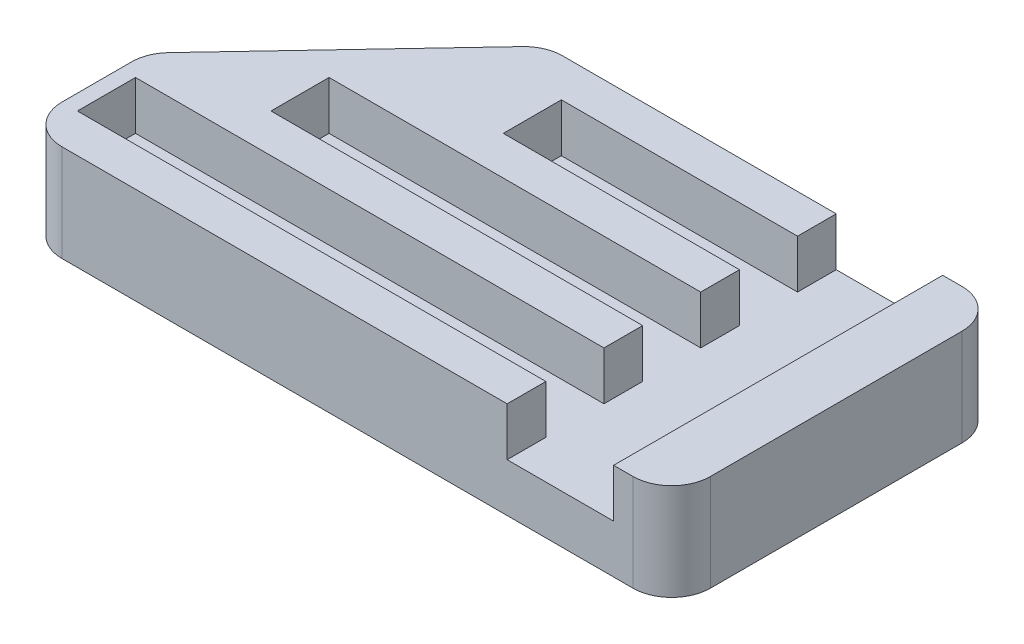
ISO-10303-21;
HEADER;
FILE_DESCRIPTION(('STEP AP214'),'2;1');
FILE_NAME('part.step','',(''),(''),'','','');
FILE_SCHEMA(('AUTOMOTIVE_DESIGN { 1 0 10303 214 1 1 1 1 }'));
ENDSEC;
DATA;
#1=APPLICATION_CONTEXT('core data for automotive mechanical design processes');
#2=APPLICATION_PROTOCOL_DEFINITION('international standard','automotive_design',2000,#1);
#3=PRODUCT_CONTEXT('',#1,'mechanical');
#4=PRODUCT('Part','Part','',(#3));
#5=PRODUCT_RELATED_PRODUCT_CATEGORY('part','',(#4));
#6=PRODUCT_DEFINITION_FORMATION('','',#4);
#7=PRODUCT_DEFINITION_CONTEXT('part definition',#1,'design');
#8=PRODUCT_DEFINITION('design','',#6,#7);
#9=PRODUCT_DEFINITION_SHAPE('','',#8);
#10=(LENGTH_UNIT() NAMED_UNIT(*) SI_UNIT(.MILLI.,.METRE.));
#11=(NAMED_UNIT(*) PLANE_ANGLE_UNIT() SI_UNIT($,.RADIAN.));
#12=(NAMED_UNIT(*) SI_UNIT($,.STERADIAN.) SOLID_ANGLE_UNIT());
#13=UNCERTAINTY_MEASURE_WITH_UNIT(LENGTH_MEASURE(1.E-05),#10,'distance_accuracy_value','');
#14=(GEOMETRIC_REPRESENTATION_CONTEXT(3) GLOBAL_UNCERTAINTY_ASSIGNED_CONTEXT((#13)) GLOBAL_UNIT_ASSIGNED_CONTEXT((#10,
#11,#12)) REPRESENTATION_CONTEXT('',''));
#15=CARTESIAN_POINT('',(0.,0.,0.));
#16=DIRECTION('',(0.,0.,1.));
#17=DIRECTION('',(1.,0.,0.));
#18=AXIS2_PLACEMENT_3D('',#15,#16,#17);
#19=CARTESIAN_POINT('',(0.,0.,0.));
#20=DIRECTION('',(0.,1.,0.));
#21=DIRECTION('',(0.,0.,1.));
#22=AXIS2_PLACEMENT_3D('',#19,#20,#21);
#23=PLANE('',#22);
#24=DIRECTION('',(-1.,0.,0.));
#25=VECTOR('',#24,1.);
#26=CARTESIAN_POINT('',(0.,0.,0.));
#27=LINE('',#26,#25);
#28=CARTESIAN_POINT('',(5.5,0.,0.));
#29=VERTEX_POINT('',#28);
#30=CARTESIAN_POINT('',(0.,0.,0.));
#31=VERTEX_POINT('',#30);
#32=EDGE_CURVE('E362',#29,#31,#27,.T.);
#33=ORIENTED_EDGE('',*,*,#32,.F.);
#34=DIRECTION('',(0.,0.,1.));
#35=VECTOR('',#34,1.);
#36=CARTESIAN_POINT('',(5.5,0.,0.));
#37=LINE('',#36,#35);
#38=CARTESIAN_POINT('',(5.5,0.,-17.));
#39=VERTEX_POINT('',#38);
#40=EDGE_CURVE('E235',#39,#29,#37,.T.);
#41=ORIENTED_EDGE('',*,*,#40,.F.);
#42=DIRECTION('',(1.,0.,0.));
#43=VECTOR('',#42,1.);
#44=CARTESIAN_POINT('',(0.,0.,-17.));
#45=LINE('',#44,#43);
#46=CARTESIAN_POINT('',(0.,0.,-17.));
#47=VERTEX_POINT('',#46);
#48=EDGE_CURVE('E219',#47,#39,#45,.T.);
#49=ORIENTED_EDGE('',*,*,#48,.F.);
#50=DIRECTION('',(0.,0.,-1.));
#51=VECTOR('',#50,1.);
#52=CARTESIAN_POINT('',(0.,0.,0.));
#53=LINE('',#52,#51);
#54=CARTESIAN_POINT('',(0.,0.,-15.));
#55=VERTEX_POINT('',#54);
#56=EDGE_CURVE('E245',#55,#47,#53,.T.);
#57=ORIENTED_EDGE('',*,*,#56,.F.);
#58=DIRECTION('',(1.,0.,0.));
#59=VECTOR('',#58,1.);
#60=CARTESIAN_POINT('',(0.,0.,-15.));
#61=LINE('',#60,#59);
#62=CARTESIAN_POINT('',(-12.2,0.,-15.));
#63=VERTEX_POINT('',#62);
#64=EDGE_CURVE('E313',#63,#55,#61,.T.);
#65=ORIENTED_EDGE('',*,*,#64,.F.);
#66=DIRECTION('',(0.,0.,-1.));
#67=VECTOR('',#66,1.);
#68=CARTESIAN_POINT('',(-12.2,0.,0.));
#69=LINE('',#68,#67);
#70=CARTESIAN_POINT('',(-12.2,0.,-12.));
#71=VERTEX_POINT('',#70);
#72=EDGE_CURVE('E310',#71,#63,#69,.T.);
#73=ORIENTED_EDGE('',*,*,#72,.F.);
#74=DIRECTION('',(-1.,0.,0.));
#75=VECTOR('',#74,1.);
#76=CARTESIAN_POINT('',(0.,0.,-12.));
#77=LINE('',#76,#75);
#78=CARTESIAN_POINT('',(0.,0.,-12.));
#79=VERTEX_POINT('',#78);
#80=EDGE_CURVE('E307',#79,#71,#77,.T.);
#81=ORIENTED_EDGE('',*,*,#80,.F.);
#82=DIRECTION('',(0.,0.,-1.));
#83=VECTOR('',#82,1.);
#84=CARTESIAN_POINT('',(0.,0.,0.));
#85=LINE('',#84,#83);
#86=CARTESIAN_POINT('',(0.,0.,-10.));
#87=VERTEX_POINT('',#86);
#88=EDGE_CURVE('E304',#87,#79,#85,.T.);
#89=ORIENTED_EDGE('',*,*,#88,.F.);
#90=DIRECTION('',(1.,0.,0.));
#91=VECTOR('',#90,1.);
#92=CARTESIAN_POINT('',(0.,0.,-10.));
#93=LINE('',#92,#91);
#94=CARTESIAN_POINT('',(-19.2,0.,-10.));
#95=VERTEX_POINT('',#94);
#96=EDGE_CURVE('E301',#95,#87,#93,.T.);
#97=ORIENTED_EDGE('',*,*,#96,.F.);
#98=DIRECTION('',(0.,0.,-1.));
#99=VECTOR('',#98,1.);
#100=CARTESIAN_POINT('',(-19.2,0.,0.));
#101=LINE('',#100,#99);
#102=CARTESIAN_POINT('',(-19.2,0.,-7.));
#103=VERTEX_POINT('',#102);
#104=EDGE_CURVE('E298',#103,#95,#101,.T.);
#105=ORIENTED_EDGE('',*,*,#104,.F.);
#106=DIRECTION('',(-1.,0.,0.));
#107=VECTOR('',#106,1.);
#108=CARTESIAN_POINT('',(0.,0.,-7.));
#109=LINE('',#108,#107);
#110=CARTESIAN_POINT('',(0.,0.,-7.));
#111=VERTEX_POINT('',#110);
#112=EDGE_CURVE('E295',#111,#103,#109,.T.);
#113=ORIENTED_EDGE('',*,*,#112,.F.);
#114=DIRECTION('',(0.,0.,-1.));
#115=VECTOR('',#114,1.);
#116=CARTESIAN_POINT('',(0.,0.,0.));
#117=LINE('',#116,#115);
#118=CARTESIAN_POINT('',(0.,0.,-5.));
#119=VERTEX_POINT('',#118);
#120=EDGE_CURVE('E292',#119,#111,#117,.T.);
#121=ORIENTED_EDGE('',*,*,#120,.F.);
#122=DIRECTION('',(1.,0.,0.));
#123=VECTOR('',#122,1.);
#124=CARTESIAN_POINT('',(0.,0.,-5.));
#125=LINE('',#124,#123);
#126=CARTESIAN_POINT('',(-24.2,0.,-5.));
#127=VERTEX_POINT('',#126);
#128=EDGE_CURVE('E289',#127,#119,#125,.T.);
#129=ORIENTED_EDGE('',*,*,#128,.F.);
#130=DIRECTION('',(0.,0.,-1.));
#131=VECTOR('',#130,1.);
#132=CARTESIAN_POINT('',(-24.2,0.,0.));
#133=LINE('',#132,#131);
#134=CARTESIAN_POINT('',(-24.2,0.,-2.));
#135=VERTEX_POINT('',#134);
#136=EDGE_CURVE('E286',#135,#127,#133,.T.);
#137=ORIENTED_EDGE('',*,*,#136,.F.);
#138=DIRECTION('',(-1.,0.,0.));
#139=VECTOR('',#138,1.);
#140=CARTESIAN_POINT('',(0.,0.,-2.));
#141=LINE('',#140,#139);
#142=CARTESIAN_POINT('',(0.,0.,-2.));
#143=VERTEX_POINT('',#142);
#144=EDGE_CURVE('E283',#143,#135,#141,.T.);
#145=ORIENTED_EDGE('',*,*,#144,.F.);
#146=DIRECTION('',(0.,0.,-1.));
#147=VECTOR('',#146,1.);
#148=CARTESIAN_POINT('',(0.,0.,0.));
#149=LINE('',#148,#147);
#150=EDGE_CURVE('E223',#31,#143,#149,.T.);
#151=ORIENTED_EDGE('',*,*,#150,.F.);
#152=EDGE_LOOP('',(#33,#41,#49,#57,#65,#73,#81,#89,#97,#105,#113,#121,#129,#137,#145,#151));
#153=FACE_BOUND('',#152,.T.);
#154=ADVANCED_FACE('F38',(#153),#23,.T.);
#155=CARTESIAN_POINT('',(0.,-2.5,-17.));
#156=DIRECTION('',(0.,0.,1.));
#157=DIRECTION('',(1.,0.,0.));
#158=AXIS2_PLACEMENT_3D('',#155,#156,#157);
#159=PLANE('',#158);
#160=DIRECTION('',(1.,0.,0.));
#161=VECTOR('',#160,1.);
#162=CARTESIAN_POINT('',(0.,-2.5,-17.));
#163=LINE('',#162,#161);
#164=CARTESIAN_POINT('',(-14.1367166432796,-2.5,-17.));
#165=VERTEX_POINT('',#164);
#166=CARTESIAN_POINT('',(6.5,-2.5,-17.));
#167=VERTEX_POINT('',#166);
#168=EDGE_CURVE('E358',#165,#167,#163,.T.);
#169=ORIENTED_EDGE('',*,*,#168,.F.);
#170=DIRECTION('',(0.,1.,0.));
#171=VECTOR('',#170,1.);
#172=CARTESIAN_POINT('',(-14.1367166432796,-2.5,-17.));
#173=LINE('',#172,#171);
#174=CARTESIAN_POINT('',(-14.1367166432796,2.5,-17.));
#175=VERTEX_POINT('',#174);
#176=EDGE_CURVE('E378',#165,#175,#173,.T.);
#177=ORIENTED_EDGE('',*,*,#176,.T.);
#178=DIRECTION('',(-1.,0.,0.));
#179=VECTOR('',#178,1.);
#180=CARTESIAN_POINT('',(0.,2.5,-17.));
#181=LINE('',#180,#179);
#182=CARTESIAN_POINT('',(0.,2.5,-17.));
#183=VERTEX_POINT('',#182);
#184=EDGE_CURVE('E277',#183,#175,#181,.T.);
#185=ORIENTED_EDGE('',*,*,#184,.F.);
#186=DIRECTION('',(0.,-1.,0.));
#187=VECTOR('',#186,1.);
#188=CARTESIAN_POINT('',(0.,2.5,-17.));
#189=LINE('',#188,#187);
#190=EDGE_CURVE('E280',#183,#47,#189,.T.);
#191=ORIENTED_EDGE('',*,*,#190,.T.);
#192=ORIENTED_EDGE('',*,*,#48,.T.);
#193=DIRECTION('',(0.,-1.,0.));
#194=VECTOR('',#193,1.);
#195=CARTESIAN_POINT('',(5.5,2.5,-17.));
#196=LINE('',#195,#194);
#197=CARTESIAN_POINT('',(5.5,2.5,-17.));
#198=VERTEX_POINT('',#197);
#199=EDGE_CURVE('E212',#198,#39,#196,.T.);
#200=ORIENTED_EDGE('',*,*,#199,.F.);
#201=DIRECTION('',(1.,0.,0.));
#202=VECTOR('',#201,1.);
#203=CARTESIAN_POINT('',(0.,2.5,-17.));
#204=LINE('',#203,#202);
#205=CARTESIAN_POINT('',(6.5,2.5,-17.));
#206=VERTEX_POINT('',#205);
#207=EDGE_CURVE('E217',#198,#206,#204,.T.);
#208=ORIENTED_EDGE('',*,*,#207,.T.);
#209=DIRECTION('',(0.,1.,0.));
#210=VECTOR('',#209,1.);
#211=CARTESIAN_POINT('',(6.5,-2.5,-17.));
#212=LINE('',#211,#210);
#213=EDGE_CURVE('E374',#206,#167,#212,.F.);
#214=ORIENTED_EDGE('',*,*,#213,.T.);
#215=EDGE_LOOP('',(#169,#177,#185,#191,#192,#200,#208,#214));
#216=FACE_BOUND('',#215,.T.);
#217=ADVANCED_FACE('F215',(#216),#159,.F.);
#218=CARTESIAN_POINT('',(8.5,-2.5,0.));
#219=DIRECTION('',(-1.,0.,0.));
#220=DIRECTION('',(0.,0.,1.));
#221=AXIS2_PLACEMENT_3D('',#218,#219,#220);
#222=PLANE('',#221);
#223=DIRECTION('',(0.,0.,1.));
#224=VECTOR('',#223,1.);
#225=CARTESIAN_POINT('',(8.5,2.5,0.));
#226=LINE('',#225,#224);
#227=CARTESIAN_POINT('',(8.5,2.5,-15.));
#228=VERTEX_POINT('',#227);
#229=CARTESIAN_POINT('',(8.5,2.5,-2.));
#230=VERTEX_POINT('',#229);
#231=EDGE_CURVE('E233',#228,#230,#226,.T.);
#232=ORIENTED_EDGE('',*,*,#231,.T.);
#233=DIRECTION('',(0.,1.,0.));
#234=VECTOR('',#233,1.);
#235=CARTESIAN_POINT('',(8.5,-2.5,-2.));
#236=LINE('',#235,#234);
#237=CARTESIAN_POINT('',(8.5,-2.5,-2.));
#238=VERTEX_POINT('',#237);
#239=EDGE_CURVE('E11',#230,#238,#236,.F.);
#240=ORIENTED_EDGE('',*,*,#239,.T.);
#241=DIRECTION('',(0.,0.,1.));
#242=VECTOR('',#241,1.);
#243=CARTESIAN_POINT('',(8.5,-2.5,0.));
#244=LINE('',#243,#242);
#245=CARTESIAN_POINT('',(8.5,-2.5,-15.));
#246=VERTEX_POINT('',#245);
#247=EDGE_CURVE('E371',#246,#238,#244,.T.);
#248=ORIENTED_EDGE('',*,*,#247,.F.);
#249=DIRECTION('',(0.,1.,0.));
#250=VECTOR('',#249,1.);
#251=CARTESIAN_POINT('',(8.5,-2.5,-15.));
#252=LINE('',#251,#250);
#253=EDGE_CURVE('E46',#246,#228,#252,.T.);
#254=ORIENTED_EDGE('',*,*,#253,.T.);
#255=EDGE_LOOP('',(#232,#240,#248,#254));
#256=FACE_BOUND('',#255,.T.);
#257=ADVANCED_FACE('F415',(#256),#222,.F.);
#258=CARTESIAN_POINT('',(0.,-2.5,0.));
#259=DIRECTION('',(0.,0.,-1.));
#260=DIRECTION('',(-1.,0.,0.));
#261=AXIS2_PLACEMENT_3D('',#258,#259,#260);
#262=PLANE('',#261);
#263=DIRECTION('',(-1.,0.,0.));
#264=VECTOR('',#263,1.);
#265=CARTESIAN_POINT('',(0.,-2.5,0.));
#266=LINE('',#265,#264);
#267=CARTESIAN_POINT('',(6.5,-2.5,0.));
#268=VERTEX_POINT('',#267);
#269=CARTESIAN_POINT('',(-23.,-2.5,0.));
#270=VERTEX_POINT('',#269);
#271=EDGE_CURVE('E368',#268,#270,#266,.T.);
#272=ORIENTED_EDGE('',*,*,#271,.F.);
#273=DIRECTION('',(0.,1.,0.));
#274=VECTOR('',#273,1.);
#275=CARTESIAN_POINT('',(6.5,-2.5,0.));
#276=LINE('',#275,#274);
#277=CARTESIAN_POINT('',(6.5,2.5,0.));
#278=VERTEX_POINT('',#277);
#279=EDGE_CURVE('E409',#268,#278,#276,.T.);
#280=ORIENTED_EDGE('',*,*,#279,.T.);
#281=DIRECTION('',(1.,0.,0.));
#282=VECTOR('',#281,1.);
#283=CARTESIAN_POINT('',(0.,2.5,0.));
#284=LINE('',#283,#282);
#285=CARTESIAN_POINT('',(5.5,2.5,0.));
#286=VERTEX_POINT('',#285);
#287=EDGE_CURVE('E230',#286,#278,#284,.T.);
#288=ORIENTED_EDGE('',*,*,#287,.F.);
#289=DIRECTION('',(0.,-1.,0.));
#290=VECTOR('',#289,1.);
#291=CARTESIAN_POINT('',(5.5,2.5,0.));
#292=LINE('',#291,#290);
#293=EDGE_CURVE('E224',#286,#29,#292,.T.);
#294=ORIENTED_EDGE('',*,*,#293,.T.);
#295=ORIENTED_EDGE('',*,*,#32,.T.);
#296=DIRECTION('',(0.,-1.,0.));
#297=VECTOR('',#296,1.);
#298=CARTESIAN_POINT('',(0.,2.5,0.));
#299=LINE('',#298,#297);
#300=CARTESIAN_POINT('',(0.,2.5,0.));
#301=VERTEX_POINT('',#300);
#302=EDGE_CURVE('E355',#301,#31,#299,.T.);
#303=ORIENTED_EDGE('',*,*,#302,.F.);
#304=DIRECTION('',(-1.,0.,0.));
#305=VECTOR('',#304,1.);
#306=CARTESIAN_POINT('',(0.,2.5,0.));
#307=LINE('',#306,#305);
#308=CARTESIAN_POINT('',(-23.,2.5,0.));
#309=VERTEX_POINT('',#308);
#310=EDGE_CURVE('E248',#301,#309,#307,.T.);
#311=ORIENTED_EDGE('',*,*,#310,.T.);
#312=DIRECTION('',(0.,1.,0.));
#313=VECTOR('',#312,1.);
#314=CARTESIAN_POINT('',(-23.,-2.5,0.));
#315=LINE('',#314,#313);
#316=EDGE_CURVE('E407',#309,#270,#315,.F.);
#317=ORIENTED_EDGE('',*,*,#316,.T.);
#318=EDGE_LOOP('',(#272,#280,#288,#294,#295,#303,#311,#317));
#319=FACE_BOUND('',#318,.T.);
#320=ADVANCED_FACE('F450',(#319),#262,.F.);
#321=CARTESIAN_POINT('',(-25.,-2.5,0.));
#322=DIRECTION('',(1.,0.,0.));
#323=DIRECTION('',(0.,0.,-1.));
#324=AXIS2_PLACEMENT_3D('',#321,#322,#323);
#325=PLANE('',#324);
#326=DIRECTION('',(0.,0.,-1.));
#327=VECTOR('',#326,1.);
#328=CARTESIAN_POINT('',(-25.,2.5,0.));
#329=LINE('',#328,#327);
#330=CARTESIAN_POINT('',(-25.,2.5,-2.));
#331=VERTEX_POINT('',#330);
#332=CARTESIAN_POINT('',(-25.,2.5,-5.59645849684286));
#333=VERTEX_POINT('',#332);
#334=EDGE_CURVE('E244',#331,#333,#329,.T.);
#335=ORIENTED_EDGE('',*,*,#334,.T.);
#336=DIRECTION('',(0.,1.,0.));
#337=VECTOR('',#336,1.);
#338=CARTESIAN_POINT('',(-25.,-2.5,-5.59645849684286));
#339=LINE('',#338,#337);
#340=CARTESIAN_POINT('',(-25.,-2.5,-5.59645849684286));
#341=VERTEX_POINT('',#340);
#342=EDGE_CURVE('E405',#333,#341,#339,.F.);
#343=ORIENTED_EDGE('',*,*,#342,.T.);
#344=DIRECTION('',(0.,0.,-1.));
#345=VECTOR('',#344,1.);
#346=CARTESIAN_POINT('',(-25.,-2.5,0.));
#347=LINE('',#346,#345);
#348=CARTESIAN_POINT('',(-25.,-2.5,-2.));
#349=VERTEX_POINT('',#348);
#350=EDGE_CURVE('E365',#349,#341,#347,.T.);
#351=ORIENTED_EDGE('',*,*,#350,.F.);
#352=DIRECTION('',(0.,1.,0.));
#353=VECTOR('',#352,1.);
#354=CARTESIAN_POINT('',(-25.,-2.5,-2.));
#355=LINE('',#354,#353);
#356=EDGE_CURVE('E402',#349,#331,#355,.T.);
#357=ORIENTED_EDGE('',*,*,#356,.T.);
#358=EDGE_LOOP('',(#335,#343,#351,#357));
#359=FACE_BOUND('',#358,.T.);
#360=ADVANCED_FACE('F441',(#359),#325,.F.);
#361=CARTESIAN_POINT('',(-16.4283935701186,-2.5,-15.4845392301185));
#362=DIRECTION('',(0.72770191100724,0.,0.685893525786919));
#363=DIRECTION('',(0.685893525786919,0.,-0.72770191100724));
#364=AXIS2_PLACEMENT_3D('',#361,#362,#363);
#365=PLANE('',#364);
#366=DIRECTION('',(0.685893525786919,0.,-0.72770191100724));
#367=VECTOR('',#366,1.);
#368=CARTESIAN_POINT('',(-16.4283935701186,2.5,-15.4845392301185));
#369=LINE('',#368,#367);
#370=CARTESIAN_POINT('',(-24.4554038220145,2.5,-6.9682455484167));
#371=VERTEX_POINT('',#370);
#372=CARTESIAN_POINT('',(-15.5921204652941,2.5,-16.3717870515738));
#373=VERTEX_POINT('',#372);
#374=EDGE_CURVE('E241',#371,#373,#369,.T.);
#375=ORIENTED_EDGE('',*,*,#374,.T.);
#376=DIRECTION('',(0.,1.,0.));
#377=VECTOR('',#376,1.);
#378=CARTESIAN_POINT('',(-15.5921204652941,-2.5,-16.3717870515738));
#379=LINE('',#378,#377);
#380=CARTESIAN_POINT('',(-15.5921204652941,-2.5,-16.3717870515738));
#381=VERTEX_POINT('',#380);
#382=EDGE_CURVE('E390',#373,#381,#379,.F.);
#383=ORIENTED_EDGE('',*,*,#382,.T.);
#384=DIRECTION('',(0.685893525786919,0.,-0.72770191100724));
#385=VECTOR('',#384,1.);
#386=CARTESIAN_POINT('',(-16.4283935701186,-2.5,-15.4845392301185));
#387=LINE('',#386,#385);
#388=CARTESIAN_POINT('',(-24.4554038220145,-2.5,-6.9682455484167));
#389=VERTEX_POINT('',#388);
#390=EDGE_CURVE('E361',#389,#381,#387,.T.);
#391=ORIENTED_EDGE('',*,*,#390,.F.);
#392=DIRECTION('',(0.,1.,0.));
#393=VECTOR('',#392,1.);
#394=CARTESIAN_POINT('',(-24.4554038220145,-2.5,-6.9682455484167));
#395=LINE('',#394,#393);
#396=EDGE_CURVE('E387',#389,#371,#395,.T.);
#397=ORIENTED_EDGE('',*,*,#396,.T.);
#398=EDGE_LOOP('',(#375,#383,#391,#397));
#399=FACE_BOUND('',#398,.T.);
#400=ADVANCED_FACE('F432',(#399),#365,.F.);
#401=CARTESIAN_POINT('',(0.,-2.5,0.));
#402=DIRECTION('',(0.,1.,0.));
#403=DIRECTION('',(0.,0.,1.));
#404=AXIS2_PLACEMENT_3D('',#401,#402,#403);
#405=PLANE('',#404);
#406=ORIENTED_EDGE('',*,*,#390,.T.);
#407=CARTESIAN_POINT('',(-14.1367166432796,-2.5,-15.));
#408=DIRECTION('',(0.,1.,0.));
#409=DIRECTION('',(0.,0.,1.));
#410=AXIS2_PLACEMENT_3D('',#407,#408,#409);
#411=CIRCLE('',#410,2.);
#412=EDGE_CURVE('E400',#381,#165,#411,.F.);
#413=ORIENTED_EDGE('',*,*,#412,.T.);
#414=ORIENTED_EDGE('',*,*,#168,.T.);
#415=CARTESIAN_POINT('',(6.5,-2.5,-15.));
#416=DIRECTION('',(0.,1.,0.));
#417=DIRECTION('',(0.,0.,1.));
#418=AXIS2_PLACEMENT_3D('',#415,#416,#417);
#419=CIRCLE('',#418,2.);
#420=EDGE_CURVE('E394',#167,#246,#419,.F.);
#421=ORIENTED_EDGE('',*,*,#420,.T.);
#422=ORIENTED_EDGE('',*,*,#247,.T.);
#423=CARTESIAN_POINT('',(6.5,-2.5,-2.));
#424=DIRECTION('',(0.,1.,0.));
#425=DIRECTION('',(0.,0.,1.));
#426=AXIS2_PLACEMENT_3D('',#423,#424,#425);
#427=CIRCLE('',#426,2.);
#428=EDGE_CURVE('E396',#238,#268,#427,.F.);
#429=ORIENTED_EDGE('',*,*,#428,.T.);
#430=ORIENTED_EDGE('',*,*,#271,.T.);
#431=CARTESIAN_POINT('',(-23.,-2.5,-2.));
#432=DIRECTION('',(0.,1.,0.));
#433=DIRECTION('',(0.,0.,1.));
#434=AXIS2_PLACEMENT_3D('',#431,#432,#433);
#435=CIRCLE('',#434,2.);
#436=EDGE_CURVE('E392',#270,#349,#435,.F.);
#437=ORIENTED_EDGE('',*,*,#436,.T.);
#438=ORIENTED_EDGE('',*,*,#350,.T.);
#439=CARTESIAN_POINT('',(-23.,-2.5,-5.59645849684286));
#440=DIRECTION('',(0.,1.,0.));
#441=DIRECTION('',(0.,0.,1.));
#442=AXIS2_PLACEMENT_3D('',#439,#440,#441);
#443=CIRCLE('',#442,2.);
#444=EDGE_CURVE('E398',#341,#389,#443,.F.);
#445=ORIENTED_EDGE('',*,*,#444,.T.);
#446=EDGE_LOOP('',(#406,#413,#414,#421,#422,#429,#430,#437,#438,#445));
#447=FACE_BOUND('',#446,.T.);
#448=ADVANCED_FACE('F420',(#447),#405,.F.);
#449=CARTESIAN_POINT('',(0.,2.5,0.));
#450=DIRECTION('',(-1.,0.,0.));
#451=DIRECTION('',(0.,0.,1.));
#452=AXIS2_PLACEMENT_3D('',#449,#450,#451);
#453=PLANE('',#452);
#454=ORIENTED_EDGE('',*,*,#150,.T.);
#455=DIRECTION('',(0.,-1.,0.));
#456=VECTOR('',#455,1.);
#457=CARTESIAN_POINT('',(0.,2.5,-2.));
#458=LINE('',#457,#456);
#459=CARTESIAN_POINT('',(0.,2.5,-2.));
#460=VERTEX_POINT('',#459);
#461=EDGE_CURVE('E352',#460,#143,#458,.T.);
#462=ORIENTED_EDGE('',*,*,#461,.F.);
#463=DIRECTION('',(0.,0.,-1.));
#464=VECTOR('',#463,1.);
#465=CARTESIAN_POINT('',(0.,2.5,0.));
#466=LINE('',#465,#464);
#467=EDGE_CURVE('E251',#301,#460,#466,.T.);
#468=ORIENTED_EDGE('',*,*,#467,.F.);
#469=ORIENTED_EDGE('',*,*,#302,.T.);
#470=EDGE_LOOP('',(#454,#462,#468,#469));
#471=FACE_BOUND('',#470,.T.);
#472=ADVANCED_FACE('F456',(#471),#453,.F.);
#473=CARTESIAN_POINT('',(0.,2.5,-2.));
#474=DIRECTION('',(0.,0.,1.));
#475=DIRECTION('',(1.,0.,0.));
#476=AXIS2_PLACEMENT_3D('',#473,#474,#475);
#477=PLANE('',#476);
#478=ORIENTED_EDGE('',*,*,#144,.T.);
#479=DIRECTION('',(0.,-1.,0.));
#480=VECTOR('',#479,1.);
#481=CARTESIAN_POINT('',(-24.2,2.5,-2.));
#482=LINE('',#481,#480);
#483=CARTESIAN_POINT('',(-24.2,2.5,-2.));
#484=VERTEX_POINT('',#483);
#485=EDGE_CURVE('E349',#484,#135,#482,.T.);
#486=ORIENTED_EDGE('',*,*,#485,.F.);
#487=DIRECTION('',(-1.,0.,0.));
#488=VECTOR('',#487,1.);
#489=CARTESIAN_POINT('',(0.,2.5,-2.));
#490=LINE('',#489,#488);
#491=EDGE_CURVE('E253',#460,#484,#490,.T.);
#492=ORIENTED_EDGE('',*,*,#491,.F.);
#493=ORIENTED_EDGE('',*,*,#461,.T.);
#494=EDGE_LOOP('',(#478,#486,#492,#493));
#495=FACE_BOUND('',#494,.T.);
#496=ADVANCED_FACE('F462',(#495),#477,.F.);
#497=CARTESIAN_POINT('',(-24.2,2.5,0.));
#498=DIRECTION('',(-1.,0.,0.));
#499=DIRECTION('',(0.,0.,1.));
#500=AXIS2_PLACEMENT_3D('',#497,#498,#499);
#501=PLANE('',#500);
#502=ORIENTED_EDGE('',*,*,#136,.T.);
#503=DIRECTION('',(0.,-1.,0.));
#504=VECTOR('',#503,1.);
#505=CARTESIAN_POINT('',(-24.2,2.5,-5.));
#506=LINE('',#505,#504);
#507=CARTESIAN_POINT('',(-24.2,2.5,-5.));
#508=VERTEX_POINT('',#507);
#509=EDGE_CURVE('E346',#508,#127,#506,.T.);
#510=ORIENTED_EDGE('',*,*,#509,.F.);
#511=DIRECTION('',(0.,0.,-1.));
#512=VECTOR('',#511,1.);
#513=CARTESIAN_POINT('',(-24.2,2.5,0.));
#514=LINE('',#513,#512);
#515=EDGE_CURVE('E255',#484,#508,#514,.T.);
#516=ORIENTED_EDGE('',*,*,#515,.F.);
#517=ORIENTED_EDGE('',*,*,#485,.T.);
#518=EDGE_LOOP('',(#502,#510,#516,#517));
#519=FACE_BOUND('',#518,.T.);
#520=ADVANCED_FACE('F464',(#519),#501,.F.);
#521=CARTESIAN_POINT('',(0.,2.5,-5.));
#522=DIRECTION('',(0.,0.,-1.));
#523=DIRECTION('',(-1.,0.,0.));
#524=AXIS2_PLACEMENT_3D('',#521,#522,#523);
#525=PLANE('',#524);
#526=ORIENTED_EDGE('',*,*,#128,.T.);
#527=DIRECTION('',(0.,-1.,0.));
#528=VECTOR('',#527,1.);
#529=CARTESIAN_POINT('',(0.,2.5,-5.));
#530=LINE('',#529,#528);
#531=CARTESIAN_POINT('',(0.,2.5,-5.));
#532=VERTEX_POINT('',#531);
#533=EDGE_CURVE('E343',#532,#119,#530,.T.);
#534=ORIENTED_EDGE('',*,*,#533,.F.);
#535=DIRECTION('',(1.,0.,0.));
#536=VECTOR('',#535,1.);
#537=CARTESIAN_POINT('',(0.,2.5,-5.));
#538=LINE('',#537,#536);
#539=EDGE_CURVE('E257',#508,#532,#538,.T.);
#540=ORIENTED_EDGE('',*,*,#539,.F.);
#541=ORIENTED_EDGE('',*,*,#509,.T.);
#542=EDGE_LOOP('',(#526,#534,#540,#541));
#543=FACE_BOUND('',#542,.T.);
#544=ADVANCED_FACE('F468',(#543),#525,.F.);
#545=CARTESIAN_POINT('',(0.,2.5,0.));
#546=DIRECTION('',(-1.,0.,0.));
#547=DIRECTION('',(0.,0.,1.));
#548=AXIS2_PLACEMENT_3D('',#545,#546,#547);
#549=PLANE('',#548);
#550=ORIENTED_EDGE('',*,*,#120,.T.);
#551=DIRECTION('',(0.,-1.,0.));
#552=VECTOR('',#551,1.);
#553=CARTESIAN_POINT('',(0.,2.5,-7.));
#554=LINE('',#553,#552);
#555=CARTESIAN_POINT('',(0.,2.5,-7.));
#556=VERTEX_POINT('',#555);
#557=EDGE_CURVE('E340',#556,#111,#554,.T.);
#558=ORIENTED_EDGE('',*,*,#557,.F.);
#559=DIRECTION('',(0.,0.,-1.));
#560=VECTOR('',#559,1.);
#561=CARTESIAN_POINT('',(0.,2.5,0.));
#562=LINE('',#561,#560);
#563=EDGE_CURVE('E259',#532,#556,#562,.T.);
#564=ORIENTED_EDGE('',*,*,#563,.F.);
#565=ORIENTED_EDGE('',*,*,#533,.T.);
#566=EDGE_LOOP('',(#550,#558,#564,#565));
#567=FACE_BOUND('',#566,.T.);
#568=ADVANCED_FACE('F474',(#567),#549,.F.);
#569=CARTESIAN_POINT('',(0.,2.5,-7.));
#570=DIRECTION('',(0.,0.,1.));
#571=DIRECTION('',(1.,0.,0.));
#572=AXIS2_PLACEMENT_3D('',#569,#570,#571);
#573=PLANE('',#572);
#574=ORIENTED_EDGE('',*,*,#112,.T.);
#575=DIRECTION('',(0.,-1.,0.));
#576=VECTOR('',#575,1.);
#577=CARTESIAN_POINT('',(-19.2,2.5,-7.));
#578=LINE('',#577,#576);
#579=CARTESIAN_POINT('',(-19.2,2.5,-7.));
#580=VERTEX_POINT('',#579);
#581=EDGE_CURVE('E337',#580,#103,#578,.T.);
#582=ORIENTED_EDGE('',*,*,#581,.F.);
#583=DIRECTION('',(-1.,0.,0.));
#584=VECTOR('',#583,1.);
#585=CARTESIAN_POINT('',(0.,2.5,-7.));
#586=LINE('',#585,#584);
#587=EDGE_CURVE('E261',#556,#580,#586,.T.);
#588=ORIENTED_EDGE('',*,*,#587,.F.);
#589=ORIENTED_EDGE('',*,*,#557,.T.);
#590=EDGE_LOOP('',(#574,#582,#588,#589));
#591=FACE_BOUND('',#590,.T.);
#592=ADVANCED_FACE('F476',(#591),#573,.F.);
#593=CARTESIAN_POINT('',(-19.2,2.5,0.));
#594=DIRECTION('',(-1.,0.,0.));
#595=DIRECTION('',(0.,0.,1.));
#596=AXIS2_PLACEMENT_3D('',#593,#594,#595);
#597=PLANE('',#596);
#598=ORIENTED_EDGE('',*,*,#104,.T.);
#599=DIRECTION('',(0.,-1.,0.));
#600=VECTOR('',#599,1.);
#601=CARTESIAN_POINT('',(-19.2,2.5,-10.));
#602=LINE('',#601,#600);
#603=CARTESIAN_POINT('',(-19.2,2.5,-10.));
#604=VERTEX_POINT('',#603);
#605=EDGE_CURVE('E334',#604,#95,#602,.T.);
#606=ORIENTED_EDGE('',*,*,#605,.F.);
#607=DIRECTION('',(0.,0.,-1.));
#608=VECTOR('',#607,1.);
#609=CARTESIAN_POINT('',(-19.2,2.5,0.));
#610=LINE('',#609,#608);
#611=EDGE_CURVE('E263',#580,#604,#610,.T.);
#612=ORIENTED_EDGE('',*,*,#611,.F.);
#613=ORIENTED_EDGE('',*,*,#581,.T.);
#614=EDGE_LOOP('',(#598,#606,#612,#613));
#615=FACE_BOUND('',#614,.T.);
#616=ADVANCED_FACE('F480',(#615),#597,.F.);
#617=CARTESIAN_POINT('',(0.,2.5,-10.));
#618=DIRECTION('',(0.,0.,-1.));
#619=DIRECTION('',(-1.,0.,0.));
#620=AXIS2_PLACEMENT_3D('',#617,#618,#619);
#621=PLANE('',#620);
#622=ORIENTED_EDGE('',*,*,#96,.T.);
#623=DIRECTION('',(0.,-1.,0.));
#624=VECTOR('',#623,1.);
#625=CARTESIAN_POINT('',(0.,2.5,-10.));
#626=LINE('',#625,#624);
#627=CARTESIAN_POINT('',(0.,2.5,-10.));
#628=VERTEX_POINT('',#627);
#629=EDGE_CURVE('E331',#628,#87,#626,.T.);
#630=ORIENTED_EDGE('',*,*,#629,.F.);
#631=DIRECTION('',(1.,0.,0.));
#632=VECTOR('',#631,1.);
#633=CARTESIAN_POINT('',(0.,2.5,-10.));
#634=LINE('',#633,#632);
#635=EDGE_CURVE('E265',#604,#628,#634,.T.);
#636=ORIENTED_EDGE('',*,*,#635,.F.);
#637=ORIENTED_EDGE('',*,*,#605,.T.);
#638=EDGE_LOOP('',(#622,#630,#636,#637));
#639=FACE_BOUND('',#638,.T.);
#640=ADVANCED_FACE('F486',(#639),#621,.F.);
#641=CARTESIAN_POINT('',(0.,2.5,0.));
#642=DIRECTION('',(-1.,0.,0.));
#643=DIRECTION('',(0.,0.,1.));
#644=AXIS2_PLACEMENT_3D('',#641,#642,#643);
#645=PLANE('',#644);
#646=ORIENTED_EDGE('',*,*,#88,.T.);
#647=DIRECTION('',(0.,-1.,0.));
#648=VECTOR('',#647,1.);
#649=CARTESIAN_POINT('',(0.,2.5,-12.));
#650=LINE('',#649,#648);
#651=CARTESIAN_POINT('',(0.,2.5,-12.));
#652=VERTEX_POINT('',#651);
#653=EDGE_CURVE('E328',#652,#79,#650,.T.);
#654=ORIENTED_EDGE('',*,*,#653,.F.);
#655=DIRECTION('',(0.,0.,-1.));
#656=VECTOR('',#655,1.);
#657=CARTESIAN_POINT('',(0.,2.5,0.));
#658=LINE('',#657,#656);
#659=EDGE_CURVE('E267',#628,#652,#658,.T.);
#660=ORIENTED_EDGE('',*,*,#659,.F.);
#661=ORIENTED_EDGE('',*,*,#629,.T.);
#662=EDGE_LOOP('',(#646,#654,#660,#661));
#663=FACE_BOUND('',#662,.T.);
#664=ADVANCED_FACE('F488',(#663),#645,.F.);
#665=CARTESIAN_POINT('',(0.,2.5,-12.));
#666=DIRECTION('',(0.,0.,1.));
#667=DIRECTION('',(1.,0.,0.));
#668=AXIS2_PLACEMENT_3D('',#665,#666,#667);
#669=PLANE('',#668);
#670=ORIENTED_EDGE('',*,*,#80,.T.);
#671=DIRECTION('',(0.,-1.,0.));
#672=VECTOR('',#671,1.);
#673=CARTESIAN_POINT('',(-12.2,2.5,-12.));
#674=LINE('',#673,#672);
#675=CARTESIAN_POINT('',(-12.2,2.5,-12.));
#676=VERTEX_POINT('',#675);
#677=EDGE_CURVE('E325',#676,#71,#674,.T.);
#678=ORIENTED_EDGE('',*,*,#677,.F.);
#679=DIRECTION('',(-1.,0.,0.));
#680=VECTOR('',#679,1.);
#681=CARTESIAN_POINT('',(0.,2.5,-12.));
#682=LINE('',#681,#680);
#683=EDGE_CURVE('E269',#652,#676,#682,.T.);
#684=ORIENTED_EDGE('',*,*,#683,.F.);
#685=ORIENTED_EDGE('',*,*,#653,.T.);
#686=EDGE_LOOP('',(#670,#678,#684,#685));
#687=FACE_BOUND('',#686,.T.);
#688=ADVANCED_FACE('F492',(#687),#669,.F.);
#689=CARTESIAN_POINT('',(-12.2,2.5,0.));
#690=DIRECTION('',(-1.,0.,0.));
#691=DIRECTION('',(0.,0.,1.));
#692=AXIS2_PLACEMENT_3D('',#689,#690,#691);
#693=PLANE('',#692);
#694=ORIENTED_EDGE('',*,*,#72,.T.);
#695=DIRECTION('',(0.,-1.,0.));
#696=VECTOR('',#695,1.);
#697=CARTESIAN_POINT('',(-12.2,2.5,-15.));
#698=LINE('',#697,#696);
#699=CARTESIAN_POINT('',(-12.2,2.5,-15.));
#700=VERTEX_POINT('',#699);
#701=EDGE_CURVE('E322',#700,#63,#698,.T.);
#702=ORIENTED_EDGE('',*,*,#701,.F.);
#703=DIRECTION('',(0.,0.,-1.));
#704=VECTOR('',#703,1.);
#705=CARTESIAN_POINT('',(-12.2,2.5,0.));
#706=LINE('',#705,#704);
#707=EDGE_CURVE('E271',#676,#700,#706,.T.);
#708=ORIENTED_EDGE('',*,*,#707,.F.);
#709=ORIENTED_EDGE('',*,*,#677,.T.);
#710=EDGE_LOOP('',(#694,#702,#708,#709));
#711=FACE_BOUND('',#710,.T.);
#712=ADVANCED_FACE('F498',(#711),#693,.F.);
#713=CARTESIAN_POINT('',(0.,2.5,-15.));
#714=DIRECTION('',(0.,0.,-1.));
#715=DIRECTION('',(-1.,0.,0.));
#716=AXIS2_PLACEMENT_3D('',#713,#714,#715);
#717=PLANE('',#716);
#718=ORIENTED_EDGE('',*,*,#64,.T.);
#719=DIRECTION('',(0.,-1.,0.));
#720=VECTOR('',#719,1.);
#721=CARTESIAN_POINT('',(0.,2.5,-15.));
#722=LINE('',#721,#720);
#723=CARTESIAN_POINT('',(0.,2.5,-15.));
#724=VERTEX_POINT('',#723);
#725=EDGE_CURVE('E319',#724,#55,#722,.T.);
#726=ORIENTED_EDGE('',*,*,#725,.F.);
#727=DIRECTION('',(1.,0.,0.));
#728=VECTOR('',#727,1.);
#729=CARTESIAN_POINT('',(0.,2.5,-15.));
#730=LINE('',#729,#728);
#731=EDGE_CURVE('E273',#700,#724,#730,.T.);
#732=ORIENTED_EDGE('',*,*,#731,.F.);
#733=ORIENTED_EDGE('',*,*,#701,.T.);
#734=EDGE_LOOP('',(#718,#726,#732,#733));
#735=FACE_BOUND('',#734,.T.);
#736=ADVANCED_FACE('F500',(#735),#717,.F.);
#737=CARTESIAN_POINT('',(0.,2.5,0.));
#738=DIRECTION('',(-1.,0.,0.));
#739=DIRECTION('',(0.,0.,1.));
#740=AXIS2_PLACEMENT_3D('',#737,#738,#739);
#741=PLANE('',#740);
#742=ORIENTED_EDGE('',*,*,#56,.T.);
#743=ORIENTED_EDGE('',*,*,#190,.F.);
#744=DIRECTION('',(0.,0.,-1.));
#745=VECTOR('',#744,1.);
#746=CARTESIAN_POINT('',(0.,2.5,0.));
#747=LINE('',#746,#745);
#748=EDGE_CURVE('E275',#724,#183,#747,.T.);
#749=ORIENTED_EDGE('',*,*,#748,.F.);
#750=ORIENTED_EDGE('',*,*,#725,.T.);
#751=EDGE_LOOP('',(#742,#743,#749,#750));
#752=FACE_BOUND('',#751,.T.);
#753=ADVANCED_FACE('F504',(#752),#741,.F.);
#754=CARTESIAN_POINT('',(0.,2.5,0.));
#755=DIRECTION('',(0.,1.,0.));
#756=DIRECTION('',(0.,0.,1.));
#757=AXIS2_PLACEMENT_3D('',#754,#755,#756);
#758=PLANE('',#757);
#759=ORIENTED_EDGE('',*,*,#184,.T.);
#760=CARTESIAN_POINT('',(-14.1367166432796,2.5,-15.));
#761=DIRECTION('',(0.,1.,0.));
#762=DIRECTION('',(0.,0.,1.));
#763=AXIS2_PLACEMENT_3D('',#760,#761,#762);
#764=CIRCLE('',#763,2.);
#765=EDGE_CURVE('E385',#175,#373,#764,.T.);
#766=ORIENTED_EDGE('',*,*,#765,.T.);
#767=ORIENTED_EDGE('',*,*,#374,.F.);
#768=CARTESIAN_POINT('',(-23.,2.5,-5.59645849684286));
#769=DIRECTION('',(0.,1.,0.));
#770=DIRECTION('',(0.,0.,1.));
#771=AXIS2_PLACEMENT_3D('',#768,#769,#770);
#772=CIRCLE('',#771,2.);
#773=EDGE_CURVE('E383',#371,#333,#772,.T.);
#774=ORIENTED_EDGE('',*,*,#773,.T.);
#775=ORIENTED_EDGE('',*,*,#334,.F.);
#776=CARTESIAN_POINT('',(-23.,2.5,-2.));
#777=DIRECTION('',(0.,1.,0.));
#778=DIRECTION('',(0.,0.,1.));
#779=AXIS2_PLACEMENT_3D('',#776,#777,#778);
#780=CIRCLE('',#779,2.);
#781=EDGE_CURVE('E381',#331,#309,#780,.T.);
#782=ORIENTED_EDGE('',*,*,#781,.T.);
#783=ORIENTED_EDGE('',*,*,#310,.F.);
#784=ORIENTED_EDGE('',*,*,#467,.T.);
#785=ORIENTED_EDGE('',*,*,#491,.T.);
#786=ORIENTED_EDGE('',*,*,#515,.T.);
#787=ORIENTED_EDGE('',*,*,#539,.T.);
#788=ORIENTED_EDGE('',*,*,#563,.T.);
#789=ORIENTED_EDGE('',*,*,#587,.T.);
#790=ORIENTED_EDGE('',*,*,#611,.T.);
#791=ORIENTED_EDGE('',*,*,#635,.T.);
#792=ORIENTED_EDGE('',*,*,#659,.T.);
#793=ORIENTED_EDGE('',*,*,#683,.T.);
#794=ORIENTED_EDGE('',*,*,#707,.T.);
#795=ORIENTED_EDGE('',*,*,#731,.T.);
#796=ORIENTED_EDGE('',*,*,#748,.T.);
#797=EDGE_LOOP('',(#759,#766,#767,#774,#775,#782,#783,#784,#785,#786,#787,#788,#789,#790,#791,
#792,#793,#794,#795,#796));
#798=FACE_BOUND('',#797,.T.);
#799=ADVANCED_FACE('F430',(#798),#758,.T.);
#800=CARTESIAN_POINT('',(5.5,2.5,0.));
#801=DIRECTION('',(1.,0.,0.));
#802=DIRECTION('',(0.,0.,-1.));
#803=AXIS2_PLACEMENT_3D('',#800,#801,#802);
#804=PLANE('',#803);
#805=ORIENTED_EDGE('',*,*,#40,.T.);
#806=ORIENTED_EDGE('',*,*,#293,.F.);
#807=DIRECTION('',(0.,0.,1.));
#808=VECTOR('',#807,1.);
#809=CARTESIAN_POINT('',(5.5,2.5,0.));
#810=LINE('',#809,#808);
#811=EDGE_CURVE('E227',#198,#286,#810,.T.);
#812=ORIENTED_EDGE('',*,*,#811,.F.);
#813=ORIENTED_EDGE('',*,*,#199,.T.);
#814=EDGE_LOOP('',(#805,#806,#812,#813));
#815=FACE_BOUND('',#814,.T.);
#816=ADVANCED_FACE('F228',(#815),#804,.F.);
#817=CARTESIAN_POINT('',(0.,2.5,0.));
#818=DIRECTION('',(0.,1.,0.));
#819=DIRECTION('',(0.,0.,1.));
#820=AXIS2_PLACEMENT_3D('',#817,#818,#819);
#821=PLANE('',#820);
#822=ORIENTED_EDGE('',*,*,#287,.T.);
#823=CARTESIAN_POINT('',(6.5,2.5,-2.));
#824=DIRECTION('',(0.,1.,0.));
#825=DIRECTION('',(0.,0.,1.));
#826=AXIS2_PLACEMENT_3D('',#823,#824,#825);
#827=CIRCLE('',#826,2.);
#828=EDGE_CURVE('E53',#278,#230,#827,.T.);
#829=ORIENTED_EDGE('',*,*,#828,.T.);
#830=ORIENTED_EDGE('',*,*,#231,.F.);
#831=CARTESIAN_POINT('',(6.5,2.5,-15.));
#832=DIRECTION('',(0.,1.,0.));
#833=DIRECTION('',(0.,0.,1.));
#834=AXIS2_PLACEMENT_3D('',#831,#832,#833);
#835=CIRCLE('',#834,2.);
#836=EDGE_CURVE('E61',#228,#206,#835,.T.);
#837=ORIENTED_EDGE('',*,*,#836,.T.);
#838=ORIENTED_EDGE('',*,*,#207,.F.);
#839=ORIENTED_EDGE('',*,*,#811,.T.);
#840=EDGE_LOOP('',(#822,#829,#830,#837,#838,#839));
#841=FACE_BOUND('',#840,.T.);
#842=ADVANCED_FACE('F232',(#841),#821,.T.);
#843=CARTESIAN_POINT('',(-14.1367166432796,-2.5,-15.));
#844=DIRECTION('',(0.,1.,0.));
#845=DIRECTION('',(0.,0.,1.));
#846=AXIS2_PLACEMENT_3D('',#843,#844,#845);
#847=CYLINDRICAL_SURFACE('',#846,2.);
#848=ORIENTED_EDGE('',*,*,#412,.F.);
#849=ORIENTED_EDGE('',*,*,#382,.F.);
#850=ORIENTED_EDGE('',*,*,#765,.F.);
#851=ORIENTED_EDGE('',*,*,#176,.F.);
#852=EDGE_LOOP('',(#848,#849,#850,#851));
#853=FACE_BOUND('',#852,.T.);
#854=ADVANCED_FACE('F426',(#853),#847,.T.);
#855=CARTESIAN_POINT('',(-23.,-2.5,-5.59645849684286));
#856=DIRECTION('',(0.,1.,0.));
#857=DIRECTION('',(0.,0.,1.));
#858=AXIS2_PLACEMENT_3D('',#855,#856,#857);
#859=CYLINDRICAL_SURFACE('',#858,2.);
#860=ORIENTED_EDGE('',*,*,#444,.F.);
#861=ORIENTED_EDGE('',*,*,#342,.F.);
#862=ORIENTED_EDGE('',*,*,#773,.F.);
#863=ORIENTED_EDGE('',*,*,#396,.F.);
#864=EDGE_LOOP('',(#860,#861,#862,#863));
#865=FACE_BOUND('',#864,.T.);
#866=ADVANCED_FACE('F437',(#865),#859,.T.);
#867=CARTESIAN_POINT('',(6.5,-2.5,-2.));
#868=DIRECTION('',(0.,1.,0.));
#869=DIRECTION('',(0.,0.,1.));
#870=AXIS2_PLACEMENT_3D('',#867,#868,#869);
#871=CYLINDRICAL_SURFACE('',#870,2.);
#872=ORIENTED_EDGE('',*,*,#428,.F.);
#873=ORIENTED_EDGE('',*,*,#239,.F.);
#874=ORIENTED_EDGE('',*,*,#828,.F.);
#875=ORIENTED_EDGE('',*,*,#279,.F.);
#876=EDGE_LOOP('',(#872,#873,#874,#875));
#877=FACE_BOUND('',#876,.T.);
#878=ADVANCED_FACE('F527',(#877),#871,.T.);
#879=CARTESIAN_POINT('',(6.5,-2.5,-15.));
#880=DIRECTION('',(0.,1.,0.));
#881=DIRECTION('',(0.,0.,1.));
#882=AXIS2_PLACEMENT_3D('',#879,#880,#881);
#883=CYLINDRICAL_SURFACE('',#882,2.);
#884=ORIENTED_EDGE('',*,*,#420,.F.);
#885=ORIENTED_EDGE('',*,*,#213,.F.);
#886=ORIENTED_EDGE('',*,*,#836,.F.);
#887=ORIENTED_EDGE('',*,*,#253,.F.);
#888=EDGE_LOOP('',(#884,#885,#886,#887));
#889=FACE_BOUND('',#888,.T.);
#890=ADVANCED_FACE('F418',(#889),#883,.T.);
#891=CARTESIAN_POINT('',(-23.,-2.5,-2.));
#892=DIRECTION('',(0.,1.,0.));
#893=DIRECTION('',(0.,0.,1.));
#894=AXIS2_PLACEMENT_3D('',#891,#892,#893);
#895=CYLINDRICAL_SURFACE('',#894,2.);
#896=ORIENTED_EDGE('',*,*,#436,.F.);
#897=ORIENTED_EDGE('',*,*,#316,.F.);
#898=ORIENTED_EDGE('',*,*,#781,.F.);
#899=ORIENTED_EDGE('',*,*,#356,.F.);
#900=EDGE_LOOP('',(#896,#897,#898,#899));
#901=FACE_BOUND('',#900,.T.);
#902=ADVANCED_FACE('F40',(#901),#895,.T.);
#903=CLOSED_SHELL('',(#154,#217,#257,#320,#360,#400,#448,#472,#496,#520,#544,#568,#592,#616,
#640,#664,#688,#712,#736,#753,#799,#816,#842,#854,#866,#878,#890,#902));
#904=MANIFOLD_SOLID_BREP('B2',#903);
#905=ADVANCED_BREP_SHAPE_REPRESENTATION('',(#18,#904),#14);
#906=SHAPE_DEFINITION_REPRESENTATION(#9,#905);
ENDSEC;
END-ISO-10303-21;
